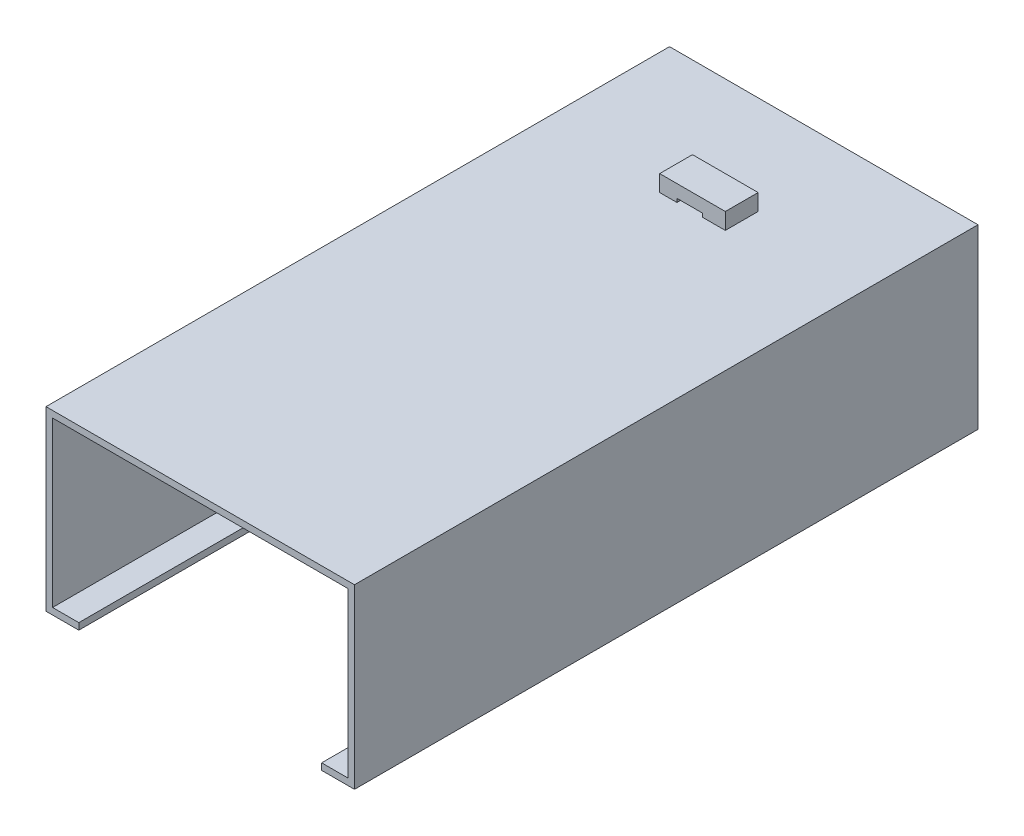
ISO-10303-21;
HEADER;
FILE_DESCRIPTION(('STEP AP214'),'2;1');
FILE_NAME('part.step','',(''),(''),'','','');
FILE_SCHEMA(('AUTOMOTIVE_DESIGN { 1 0 10303 214 1 1 1 1 }'));
ENDSEC;
DATA;
#1=APPLICATION_CONTEXT('core data for automotive mechanical design processes');
#2=APPLICATION_PROTOCOL_DEFINITION('international standard','automotive_design',2000,#1);
#3=PRODUCT_CONTEXT('',#1,'mechanical');
#4=PRODUCT('Part','Part','',(#3));
#5=PRODUCT_RELATED_PRODUCT_CATEGORY('part','',(#4));
#6=PRODUCT_DEFINITION_FORMATION('','',#4);
#7=PRODUCT_DEFINITION_CONTEXT('part definition',#1,'design');
#8=PRODUCT_DEFINITION('design','',#6,#7);
#9=PRODUCT_DEFINITION_SHAPE('','',#8);
#10=(LENGTH_UNIT() NAMED_UNIT(*) SI_UNIT(.MILLI.,.METRE.));
#11=(NAMED_UNIT(*) PLANE_ANGLE_UNIT() SI_UNIT($,.RADIAN.));
#12=(NAMED_UNIT(*) SI_UNIT($,.STERADIAN.) SOLID_ANGLE_UNIT());
#13=UNCERTAINTY_MEASURE_WITH_UNIT(LENGTH_MEASURE(1.E-05),#10,'distance_accuracy_value','');
#14=(GEOMETRIC_REPRESENTATION_CONTEXT(3) GLOBAL_UNCERTAINTY_ASSIGNED_CONTEXT((#13)) GLOBAL_UNIT_ASSIGNED_CONTEXT((#10,
#11,#12)) REPRESENTATION_CONTEXT('',''));
#15=CARTESIAN_POINT('',(0.,0.,0.));
#16=DIRECTION('',(0.,0.,1.));
#17=DIRECTION('',(1.,0.,0.));
#18=AXIS2_PLACEMENT_3D('',#15,#16,#17);
#19=CARTESIAN_POINT('',(-5.96899999999989,3.42900000000013,24.1300000000001));
#20=DIRECTION('',(0.,-1.,0.));
#21=DIRECTION('',(0.,0.,-1.));
#22=AXIS2_PLACEMENT_3D('',#19,#20,#21);
#23=PLANE('',#22);
#24=DIRECTION('',(1.,0.,0.));
#25=VECTOR('',#24,1.);
#26=CARTESIAN_POINT('',(1.2700000000001,3.42900000000024,5.08000000000042));
#27=LINE('',#26,#25);
#28=CARTESIAN_POINT('',(0.381477697240395,3.42900000000024,5.08000000000042));
#29=VERTEX_POINT('',#28);
#30=CARTESIAN_POINT('',(1.2700000000001,3.42900000000024,5.08000000000042));
#31=VERTEX_POINT('',#30);
#32=EDGE_CURVE('E524',#29,#31,#27,.T.);
#33=ORIENTED_EDGE('',*,*,#32,.F.);
#34=DIRECTION('',(0.,0.,1.));
#35=VECTOR('',#34,1.);
#36=CARTESIAN_POINT('',(0.381477697240395,3.42900000000079,-0.00100000000013978));
#37=LINE('',#36,#35);
#38=CARTESIAN_POINT('',(0.381477697240395,3.42900000000013,3.81000000000009));
#39=VERTEX_POINT('',#38);
#40=EDGE_CURVE('E186',#39,#29,#37,.T.);
#41=ORIENTED_EDGE('',*,*,#40,.F.);
#42=DIRECTION('',(-1.,0.,0.));
#43=VECTOR('',#42,1.);
#44=CARTESIAN_POINT('',(1.2700000000001,3.42900000000013,3.81000000000009));
#45=LINE('',#44,#43);
#46=CARTESIAN_POINT('',(1.2700000000001,3.42900000000013,3.81000000000009));
#47=VERTEX_POINT('',#46);
#48=EDGE_CURVE('E200',#47,#39,#45,.T.);
#49=ORIENTED_EDGE('',*,*,#48,.F.);
#50=DIRECTION('',(0.,0.,-1.));
#51=VECTOR('',#50,1.);
#52=CARTESIAN_POINT('',(1.2700000000001,3.42900000000024,5.08000000000042));
#53=LINE('',#52,#51);
#54=EDGE_CURVE('E201',#31,#47,#53,.T.);
#55=ORIENTED_EDGE('',*,*,#54,.F.);
#56=EDGE_LOOP('',(#33,#41,#49,#55));
#57=FACE_BOUND('',#56,.T.);
#58=DIRECTION('',(-1.,0.,0.));
#59=VECTOR('',#58,1.);
#60=CARTESIAN_POINT('',(-5.96899999999989,3.42900000000079,0.));
#61=LINE('',#60,#59);
#62=CARTESIAN_POINT('',(5.96899999999989,3.42900000000079,0.));
#63=VERTEX_POINT('',#62);
#64=CARTESIAN_POINT('',(-5.96899999999989,3.42900000000079,0.));
#65=VERTEX_POINT('',#64);
#66=EDGE_CURVE('E254',#63,#65,#61,.T.);
#67=ORIENTED_EDGE('',*,*,#66,.T.);
#68=DIRECTION('',(0.,0.,-1.));
#69=VECTOR('',#68,1.);
#70=CARTESIAN_POINT('',(-5.96899999999989,3.42900000000013,24.1300000000001));
#71=LINE('',#70,#69);
#72=CARTESIAN_POINT('',(-5.96899999999989,3.42900000000013,24.1300000000001));
#73=VERTEX_POINT('',#72);
#74=EDGE_CURVE('E299',#73,#65,#71,.T.);
#75=ORIENTED_EDGE('',*,*,#74,.F.);
#76=DIRECTION('',(-1.,0.,0.));
#77=VECTOR('',#76,1.);
#78=CARTESIAN_POINT('',(-5.96899999999989,3.42900000000013,24.1300000000001));
#79=LINE('',#78,#77);
#80=CARTESIAN_POINT('',(5.96900000000011,3.42900000000013,24.1300000000001));
#81=VERTEX_POINT('',#80);
#82=EDGE_CURVE('E229',#81,#73,#79,.T.);
#83=ORIENTED_EDGE('',*,*,#82,.F.);
#84=DIRECTION('',(0.,0.,-1.));
#85=VECTOR('',#84,1.);
#86=CARTESIAN_POINT('',(5.96900000000011,3.42900000000013,24.1300000000001));
#87=LINE('',#86,#85);
#88=EDGE_CURVE('E51',#81,#63,#87,.T.);
#89=ORIENTED_EDGE('',*,*,#88,.T.);
#90=EDGE_LOOP('',(#67,#75,#83,#89));
#91=FACE_BOUND('',#90,.T.);
#92=DIRECTION('',(0.,0.,1.));
#93=VECTOR('',#92,1.);
#94=CARTESIAN_POINT('',(-1.2700000000001,3.42900000000024,5.08000000000042));
#95=LINE('',#94,#93);
#96=CARTESIAN_POINT('',(-1.2700000000001,3.42900000000013,3.81000000000009));
#97=VERTEX_POINT('',#96);
#98=CARTESIAN_POINT('',(-1.2700000000001,3.42900000000024,5.08000000000042));
#99=VERTEX_POINT('',#98);
#100=EDGE_CURVE('E198',#97,#99,#95,.T.);
#101=ORIENTED_EDGE('',*,*,#100,.F.);
#102=CARTESIAN_POINT('',(-0.603337681881921,3.42900000000013,3.81000000000009));
#103=VERTEX_POINT('',#102);
#104=EDGE_CURVE('E192',#103,#97,#45,.T.);
#105=ORIENTED_EDGE('',*,*,#104,.F.);
#106=DIRECTION('',(0.,0.,1.));
#107=VECTOR('',#106,1.);
#108=CARTESIAN_POINT('',(-0.603337681881921,3.42900000000079,-0.00100000000013978));
#109=LINE('',#108,#107);
#110=CARTESIAN_POINT('',(-0.603337681881921,3.42900000000024,5.08000000000042));
#111=VERTEX_POINT('',#110);
#112=EDGE_CURVE('E178',#103,#111,#109,.T.);
#113=ORIENTED_EDGE('',*,*,#112,.T.);
#114=EDGE_CURVE('E206',#99,#111,#27,.T.);
#115=ORIENTED_EDGE('',*,*,#114,.F.);
#116=EDGE_LOOP('',(#101,#105,#113,#115));
#117=FACE_BOUND('',#116,.T.);
#118=ADVANCED_FACE('F43',(#57,#91,#117),#23,.F.);
#119=CARTESIAN_POINT('',(4.69900000000001,-3.42899999999979,24.13));
#120=DIRECTION('',(0.,1.,0.));
#121=DIRECTION('',(0.,0.,1.));
#122=AXIS2_PLACEMENT_3D('',#119,#120,#121);
#123=PLANE('',#122);
#124=DIRECTION('',(1.,0.,0.));
#125=VECTOR('',#124,1.);
#126=CARTESIAN_POINT('',(4.69900000000001,-3.42899999999935,4.44089209850063E-13));
#127=LINE('',#126,#125);
#128=CARTESIAN_POINT('',(4.69900000000001,-3.42899999999935,4.44089209850063E-13));
#129=VERTEX_POINT('',#128);
#130=CARTESIAN_POINT('',(5.96899999999989,-3.42899999999935,4.44089209850063E-13));
#131=VERTEX_POINT('',#130);
#132=EDGE_CURVE('E222',#129,#131,#127,.T.);
#133=ORIENTED_EDGE('',*,*,#132,.T.);
#134=DIRECTION('',(0.,0.,-1.));
#135=VECTOR('',#134,1.);
#136=CARTESIAN_POINT('',(5.96900000000011,-3.42899999999979,24.13));
#137=LINE('',#136,#135);
#138=CARTESIAN_POINT('',(5.96900000000011,-3.42899999999979,24.13));
#139=VERTEX_POINT('',#138);
#140=EDGE_CURVE('E11',#139,#131,#137,.T.);
#141=ORIENTED_EDGE('',*,*,#140,.F.);
#142=DIRECTION('',(1.,0.,0.));
#143=VECTOR('',#142,1.);
#144=CARTESIAN_POINT('',(4.69900000000001,-3.42899999999979,24.13));
#145=LINE('',#144,#143);
#146=CARTESIAN_POINT('',(4.69900000000001,-3.42899999999979,24.13));
#147=VERTEX_POINT('',#146);
#148=EDGE_CURVE('E223',#147,#139,#145,.T.);
#149=ORIENTED_EDGE('',*,*,#148,.F.);
#150=DIRECTION('',(0.,0.,-1.));
#151=VECTOR('',#150,1.);
#152=CARTESIAN_POINT('',(4.69900000000001,-3.42899999999979,24.13));
#153=LINE('',#152,#151);
#154=EDGE_CURVE('E249',#147,#129,#153,.T.);
#155=ORIENTED_EDGE('',*,*,#154,.T.);
#156=EDGE_LOOP('',(#133,#141,#149,#155));
#157=FACE_BOUND('',#156,.T.);
#158=ADVANCED_FACE('F45',(#157),#123,.F.);
#159=CARTESIAN_POINT('',(5.96900000000011,3.42900000000013,24.1300000000001));
#160=DIRECTION('',(-1.,0.,0.));
#161=DIRECTION('',(0.,-1.,0.));
#162=AXIS2_PLACEMENT_3D('',#159,#160,#161);
#163=PLANE('',#162);
#164=DIRECTION('',(0.,1.,0.));
#165=VECTOR('',#164,1.);
#166=CARTESIAN_POINT('',(5.96899999999989,3.42900000000079,0.));
#167=LINE('',#166,#165);
#168=EDGE_CURVE('E252',#131,#63,#167,.T.);
#169=ORIENTED_EDGE('',*,*,#168,.T.);
#170=ORIENTED_EDGE('',*,*,#88,.F.);
#171=DIRECTION('',(0.,1.,0.));
#172=VECTOR('',#171,1.);
#173=CARTESIAN_POINT('',(5.96900000000011,3.42900000000013,24.1300000000001));
#174=LINE('',#173,#172);
#175=EDGE_CURVE('E226',#139,#81,#174,.T.);
#176=ORIENTED_EDGE('',*,*,#175,.F.);
#177=ORIENTED_EDGE('',*,*,#140,.T.);
#178=EDGE_LOOP('',(#169,#170,#176,#177));
#179=FACE_BOUND('',#178,.T.);
#180=ADVANCED_FACE('F328',(#179),#163,.F.);
#181=CARTESIAN_POINT('',(-5.96899999999989,3.42900000000013,24.1300000000001));
#182=DIRECTION('',(1.,0.,0.));
#183=DIRECTION('',(0.,1.,0.));
#184=AXIS2_PLACEMENT_3D('',#181,#182,#183);
#185=PLANE('',#184);
#186=DIRECTION('',(0.,-1.,0.));
#187=VECTOR('',#186,1.);
#188=CARTESIAN_POINT('',(-5.96899999999989,3.42900000000079,0.));
#189=LINE('',#188,#187);
#190=CARTESIAN_POINT('',(-5.96899999999989,-3.42899999999935,4.44089209850063E-13));
#191=VERTEX_POINT('',#190);
#192=EDGE_CURVE('E256',#65,#191,#189,.T.);
#193=ORIENTED_EDGE('',*,*,#192,.T.);
#194=DIRECTION('',(0.,0.,-1.));
#195=VECTOR('',#194,1.);
#196=CARTESIAN_POINT('',(-5.96899999999989,-3.42899999999979,24.13));
#197=LINE('',#196,#195);
#198=CARTESIAN_POINT('',(-5.96899999999989,-3.42899999999979,24.13));
#199=VERTEX_POINT('',#198);
#200=EDGE_CURVE('E296',#199,#191,#197,.T.);
#201=ORIENTED_EDGE('',*,*,#200,.F.);
#202=DIRECTION('',(0.,-1.,0.));
#203=VECTOR('',#202,1.);
#204=CARTESIAN_POINT('',(-5.96899999999989,3.42900000000013,24.1300000000001));
#205=LINE('',#204,#203);
#206=EDGE_CURVE('E231',#73,#199,#205,.T.);
#207=ORIENTED_EDGE('',*,*,#206,.F.);
#208=ORIENTED_EDGE('',*,*,#74,.T.);
#209=EDGE_LOOP('',(#193,#201,#207,#208));
#210=FACE_BOUND('',#209,.T.);
#211=ADVANCED_FACE('F316',(#210),#185,.F.);
#212=CARTESIAN_POINT('',(-5.96899999999989,-3.42899999999979,24.13));
#213=DIRECTION('',(0.,1.,0.));
#214=DIRECTION('',(0.,0.,1.));
#215=AXIS2_PLACEMENT_3D('',#212,#213,#214);
#216=PLANE('',#215);
#217=DIRECTION('',(1.,0.,0.));
#218=VECTOR('',#217,1.);
#219=CARTESIAN_POINT('',(-5.96899999999989,-3.42899999999935,4.44089209850063E-13));
#220=LINE('',#219,#218);
#221=CARTESIAN_POINT('',(-4.69900000000001,-3.42899999999935,4.44089209850063E-13));
#222=VERTEX_POINT('',#221);
#223=EDGE_CURVE('E258',#191,#222,#220,.T.);
#224=ORIENTED_EDGE('',*,*,#223,.T.);
#225=DIRECTION('',(0.,0.,-1.));
#226=VECTOR('',#225,1.);
#227=CARTESIAN_POINT('',(-4.69900000000001,-3.42899999999979,24.13));
#228=LINE('',#227,#226);
#229=CARTESIAN_POINT('',(-4.69900000000001,-3.42899999999979,24.13));
#230=VERTEX_POINT('',#229);
#231=EDGE_CURVE('E293',#230,#222,#228,.T.);
#232=ORIENTED_EDGE('',*,*,#231,.F.);
#233=DIRECTION('',(1.,0.,0.));
#234=VECTOR('',#233,1.);
#235=CARTESIAN_POINT('',(-5.96899999999989,-3.42899999999979,24.13));
#236=LINE('',#235,#234);
#237=EDGE_CURVE('E233',#199,#230,#236,.T.);
#238=ORIENTED_EDGE('',*,*,#237,.F.);
#239=ORIENTED_EDGE('',*,*,#200,.T.);
#240=EDGE_LOOP('',(#224,#232,#238,#239));
#241=FACE_BOUND('',#240,.T.);
#242=ADVANCED_FACE('F320',(#241),#216,.F.);
#243=CARTESIAN_POINT('',(-4.69900000000001,-3.17499999999948,24.13));
#244=DIRECTION('',(-1.,0.,0.));
#245=DIRECTION('',(0.,0.,1.));
#246=AXIS2_PLACEMENT_3D('',#243,#244,#245);
#247=PLANE('',#246);
#248=DIRECTION('',(0.,1.,0.));
#249=VECTOR('',#248,1.);
#250=CARTESIAN_POINT('',(-4.69900000000001,-3.17499999999982,0.));
#251=LINE('',#250,#249);
#252=CARTESIAN_POINT('',(-4.69900000000001,-3.17499999999982,0.));
#253=VERTEX_POINT('',#252);
#254=EDGE_CURVE('E260',#222,#253,#251,.T.);
#255=ORIENTED_EDGE('',*,*,#254,.T.);
#256=DIRECTION('',(0.,0.,-1.));
#257=VECTOR('',#256,1.);
#258=CARTESIAN_POINT('',(-4.69900000000001,-3.17499999999948,24.13));
#259=LINE('',#258,#257);
#260=CARTESIAN_POINT('',(-4.69900000000001,-3.17499999999948,24.13));
#261=VERTEX_POINT('',#260);
#262=EDGE_CURVE('E290',#261,#253,#259,.T.);
#263=ORIENTED_EDGE('',*,*,#262,.F.);
#264=DIRECTION('',(0.,1.,0.));
#265=VECTOR('',#264,1.);
#266=CARTESIAN_POINT('',(-4.69900000000001,-3.17499999999948,24.13));
#267=LINE('',#266,#265);
#268=EDGE_CURVE('E235',#230,#261,#267,.T.);
#269=ORIENTED_EDGE('',*,*,#268,.F.);
#270=ORIENTED_EDGE('',*,*,#231,.T.);
#271=EDGE_LOOP('',(#255,#263,#269,#270));
#272=FACE_BOUND('',#271,.T.);
#273=ADVANCED_FACE('F361',(#272),#247,.F.);
#274=CARTESIAN_POINT('',(-5.71499999999991,-3.17499999999948,24.13));
#275=DIRECTION('',(0.,-1.,0.));
#276=DIRECTION('',(1.,0.,0.));
#277=AXIS2_PLACEMENT_3D('',#274,#275,#276);
#278=PLANE('',#277);
#279=DIRECTION('',(-1.,0.,0.));
#280=VECTOR('',#279,1.);
#281=CARTESIAN_POINT('',(-5.71499999999991,-3.17499999999982,0.));
#282=LINE('',#281,#280);
#283=CARTESIAN_POINT('',(-5.71499999999991,-3.17499999999982,0.));
#284=VERTEX_POINT('',#283);
#285=EDGE_CURVE('E262',#253,#284,#282,.T.);
#286=ORIENTED_EDGE('',*,*,#285,.T.);
#287=DIRECTION('',(0.,0.,-1.));
#288=VECTOR('',#287,1.);
#289=CARTESIAN_POINT('',(-5.71499999999991,-3.17499999999948,24.13));
#290=LINE('',#289,#288);
#291=CARTESIAN_POINT('',(-5.71499999999991,-3.17499999999948,24.13));
#292=VERTEX_POINT('',#291);
#293=EDGE_CURVE('E287',#292,#284,#290,.T.);
#294=ORIENTED_EDGE('',*,*,#293,.F.);
#295=DIRECTION('',(-1.,0.,0.));
#296=VECTOR('',#295,1.);
#297=CARTESIAN_POINT('',(-5.71499999999991,-3.17499999999948,24.13));
#298=LINE('',#297,#296);
#299=EDGE_CURVE('E237',#261,#292,#298,.T.);
#300=ORIENTED_EDGE('',*,*,#299,.F.);
#301=ORIENTED_EDGE('',*,*,#262,.T.);
#302=EDGE_LOOP('',(#286,#294,#300,#301));
#303=FACE_BOUND('',#302,.T.);
#304=ADVANCED_FACE('F359',(#303),#278,.F.);
#305=CARTESIAN_POINT('',(-5.71499999999991,3.17500000000104,24.1300000000004));
#306=DIRECTION('',(-1.,0.,0.));
#307=DIRECTION('',(0.,-1.,0.));
#308=AXIS2_PLACEMENT_3D('',#305,#306,#307);
#309=PLANE('',#308);
#310=DIRECTION('',(0.,1.,0.));
#311=VECTOR('',#310,1.);
#312=CARTESIAN_POINT('',(-5.71499999999991,3.17500000000015,4.44089209850063E-13));
#313=LINE('',#312,#311);
#314=CARTESIAN_POINT('',(-5.71499999999991,3.17500000000015,4.44089209850063E-13));
#315=VERTEX_POINT('',#314);
#316=EDGE_CURVE('E264',#284,#315,#313,.T.);
#317=ORIENTED_EDGE('',*,*,#316,.T.);
#318=DIRECTION('',(0.,0.,-1.));
#319=VECTOR('',#318,1.);
#320=CARTESIAN_POINT('',(-5.71499999999991,3.17500000000104,24.1300000000004));
#321=LINE('',#320,#319);
#322=CARTESIAN_POINT('',(-5.71499999999991,3.17500000000104,24.1300000000004));
#323=VERTEX_POINT('',#322);
#324=EDGE_CURVE('E284',#323,#315,#321,.T.);
#325=ORIENTED_EDGE('',*,*,#324,.F.);
#326=DIRECTION('',(0.,1.,0.));
#327=VECTOR('',#326,1.);
#328=CARTESIAN_POINT('',(-5.71499999999991,3.17500000000104,24.1300000000004));
#329=LINE('',#328,#327);
#330=EDGE_CURVE('E239',#292,#323,#329,.T.);
#331=ORIENTED_EDGE('',*,*,#330,.F.);
#332=ORIENTED_EDGE('',*,*,#293,.T.);
#333=EDGE_LOOP('',(#317,#325,#331,#332));
#334=FACE_BOUND('',#333,.T.);
#335=ADVANCED_FACE('F355',(#334),#309,.F.);
#336=CARTESIAN_POINT('',(-5.71499999999991,3.17500000000104,24.1300000000004));
#337=DIRECTION('',(0.,1.,0.));
#338=DIRECTION('',(0.,0.,1.));
#339=AXIS2_PLACEMENT_3D('',#336,#337,#338);
#340=PLANE('',#339);
#341=DIRECTION('',(1.,0.,0.));
#342=VECTOR('',#341,1.);
#343=CARTESIAN_POINT('',(-5.71499999999991,3.17500000000015,4.44089209850063E-13));
#344=LINE('',#343,#342);
#345=CARTESIAN_POINT('',(5.71499999999991,3.17500000000015,4.44089209850063E-13));
#346=VERTEX_POINT('',#345);
#347=EDGE_CURVE('E266',#315,#346,#344,.T.);
#348=ORIENTED_EDGE('',*,*,#347,.T.);
#349=DIRECTION('',(0.,0.,-1.));
#350=VECTOR('',#349,1.);
#351=CARTESIAN_POINT('',(5.71499999999991,3.17500000000104,24.1300000000004));
#352=LINE('',#351,#350);
#353=CARTESIAN_POINT('',(5.71499999999991,3.17500000000104,24.1300000000004));
#354=VERTEX_POINT('',#353);
#355=EDGE_CURVE('E281',#354,#346,#352,.T.);
#356=ORIENTED_EDGE('',*,*,#355,.F.);
#357=DIRECTION('',(1.,0.,0.));
#358=VECTOR('',#357,1.);
#359=CARTESIAN_POINT('',(-5.71499999999991,3.17500000000104,24.1300000000004));
#360=LINE('',#359,#358);
#361=EDGE_CURVE('E241',#323,#354,#360,.T.);
#362=ORIENTED_EDGE('',*,*,#361,.F.);
#363=ORIENTED_EDGE('',*,*,#324,.T.);
#364=EDGE_LOOP('',(#348,#356,#362,#363));
#365=FACE_BOUND('',#364,.T.);
#366=ADVANCED_FACE('F350',(#365),#340,.F.);
#367=CARTESIAN_POINT('',(5.71499999999991,3.17500000000104,24.1300000000004));
#368=DIRECTION('',(1.,0.,0.));
#369=DIRECTION('',(0.,0.,-1.));
#370=AXIS2_PLACEMENT_3D('',#367,#368,#369);
#371=PLANE('',#370);
#372=DIRECTION('',(0.,-1.,0.));
#373=VECTOR('',#372,1.);
#374=CARTESIAN_POINT('',(5.71499999999991,3.17500000000015,4.44089209850063E-13));
#375=LINE('',#374,#373);
#376=CARTESIAN_POINT('',(5.71499999999991,-3.17499999999982,0.));
#377=VERTEX_POINT('',#376);
#378=EDGE_CURVE('E268',#346,#377,#375,.T.);
#379=ORIENTED_EDGE('',*,*,#378,.T.);
#380=DIRECTION('',(0.,0.,-1.));
#381=VECTOR('',#380,1.);
#382=CARTESIAN_POINT('',(5.71499999999991,-3.17499999999948,24.13));
#383=LINE('',#382,#381);
#384=CARTESIAN_POINT('',(5.71499999999991,-3.17499999999948,24.13));
#385=VERTEX_POINT('',#384);
#386=EDGE_CURVE('E278',#385,#377,#383,.T.);
#387=ORIENTED_EDGE('',*,*,#386,.F.);
#388=DIRECTION('',(0.,-1.,0.));
#389=VECTOR('',#388,1.);
#390=CARTESIAN_POINT('',(5.71499999999991,3.17500000000104,24.1300000000004));
#391=LINE('',#390,#389);
#392=EDGE_CURVE('E243',#354,#385,#391,.T.);
#393=ORIENTED_EDGE('',*,*,#392,.F.);
#394=ORIENTED_EDGE('',*,*,#355,.T.);
#395=EDGE_LOOP('',(#379,#387,#393,#394));
#396=FACE_BOUND('',#395,.T.);
#397=ADVANCED_FACE('F344',(#396),#371,.F.);
#398=CARTESIAN_POINT('',(4.69900000000001,-3.17499999999948,24.13));
#399=DIRECTION('',(0.,-1.,0.));
#400=DIRECTION('',(1.,0.,0.));
#401=AXIS2_PLACEMENT_3D('',#398,#399,#400);
#402=PLANE('',#401);
#403=DIRECTION('',(-1.,0.,0.));
#404=VECTOR('',#403,1.);
#405=CARTESIAN_POINT('',(4.69900000000001,-3.17499999999982,0.));
#406=LINE('',#405,#404);
#407=CARTESIAN_POINT('',(4.69900000000001,-3.17499999999982,0.));
#408=VERTEX_POINT('',#407);
#409=EDGE_CURVE('E270',#377,#408,#406,.T.);
#410=ORIENTED_EDGE('',*,*,#409,.T.);
#411=DIRECTION('',(0.,0.,-1.));
#412=VECTOR('',#411,1.);
#413=CARTESIAN_POINT('',(4.69900000000001,-3.17499999999948,24.13));
#414=LINE('',#413,#412);
#415=CARTESIAN_POINT('',(4.69900000000001,-3.17499999999948,24.13));
#416=VERTEX_POINT('',#415);
#417=EDGE_CURVE('E275',#416,#408,#414,.T.);
#418=ORIENTED_EDGE('',*,*,#417,.F.);
#419=DIRECTION('',(-1.,0.,0.));
#420=VECTOR('',#419,1.);
#421=CARTESIAN_POINT('',(4.69900000000001,-3.17499999999948,24.13));
#422=LINE('',#421,#420);
#423=EDGE_CURVE('E245',#385,#416,#422,.T.);
#424=ORIENTED_EDGE('',*,*,#423,.F.);
#425=ORIENTED_EDGE('',*,*,#386,.T.);
#426=EDGE_LOOP('',(#410,#418,#424,#425));
#427=FACE_BOUND('',#426,.T.);
#428=ADVANCED_FACE('F340',(#427),#402,.F.);
#429=CARTESIAN_POINT('',(4.69900000000001,-3.17499999999948,24.13));
#430=DIRECTION('',(1.,0.,0.));
#431=DIRECTION('',(0.,0.,-1.));
#432=AXIS2_PLACEMENT_3D('',#429,#430,#431);
#433=PLANE('',#432);
#434=DIRECTION('',(0.,-1.,0.));
#435=VECTOR('',#434,1.);
#436=CARTESIAN_POINT('',(4.69900000000001,-3.17499999999982,0.));
#437=LINE('',#436,#435);
#438=EDGE_CURVE('E227',#408,#129,#437,.T.);
#439=ORIENTED_EDGE('',*,*,#438,.T.);
#440=ORIENTED_EDGE('',*,*,#154,.F.);
#441=DIRECTION('',(0.,-1.,0.));
#442=VECTOR('',#441,1.);
#443=CARTESIAN_POINT('',(4.69900000000001,-3.17499999999948,24.13));
#444=LINE('',#443,#442);
#445=EDGE_CURVE('E247',#416,#147,#444,.T.);
#446=ORIENTED_EDGE('',*,*,#445,.F.);
#447=ORIENTED_EDGE('',*,*,#417,.T.);
#448=EDGE_LOOP('',(#439,#440,#446,#447));
#449=FACE_BOUND('',#448,.T.);
#450=ADVANCED_FACE('F335',(#449),#433,.F.);
#451=CARTESIAN_POINT('',(0.,1.11022302462516E-13,24.13));
#452=DIRECTION('',(0.,0.,-1.));
#453=DIRECTION('',(-1.,0.,0.));
#454=AXIS2_PLACEMENT_3D('',#451,#452,#453);
#455=PLANE('',#454);
#456=ORIENTED_EDGE('',*,*,#148,.T.);
#457=ORIENTED_EDGE('',*,*,#175,.T.);
#458=ORIENTED_EDGE('',*,*,#82,.T.);
#459=ORIENTED_EDGE('',*,*,#206,.T.);
#460=ORIENTED_EDGE('',*,*,#237,.T.);
#461=ORIENTED_EDGE('',*,*,#268,.T.);
#462=ORIENTED_EDGE('',*,*,#299,.T.);
#463=ORIENTED_EDGE('',*,*,#330,.T.);
#464=ORIENTED_EDGE('',*,*,#361,.T.);
#465=ORIENTED_EDGE('',*,*,#392,.T.);
#466=ORIENTED_EDGE('',*,*,#423,.T.);
#467=ORIENTED_EDGE('',*,*,#445,.T.);
#468=EDGE_LOOP('',(#456,#457,#458,#459,#460,#461,#462,#463,#464,#465,#466,#467));
#469=FACE_BOUND('',#468,.T.);
#470=ADVANCED_FACE('F324',(#469),#455,.F.);
#471=CARTESIAN_POINT('',(0.,0.,0.));
#472=DIRECTION('',(0.,0.,-1.));
#473=DIRECTION('',(-1.,0.,0.));
#474=AXIS2_PLACEMENT_3D('',#471,#472,#473);
#475=PLANE('',#474);
#476=ORIENTED_EDGE('',*,*,#132,.F.);
#477=ORIENTED_EDGE('',*,*,#438,.F.);
#478=ORIENTED_EDGE('',*,*,#409,.F.);
#479=ORIENTED_EDGE('',*,*,#378,.F.);
#480=ORIENTED_EDGE('',*,*,#347,.F.);
#481=ORIENTED_EDGE('',*,*,#316,.F.);
#482=ORIENTED_EDGE('',*,*,#285,.F.);
#483=ORIENTED_EDGE('',*,*,#254,.F.);
#484=ORIENTED_EDGE('',*,*,#223,.F.);
#485=ORIENTED_EDGE('',*,*,#192,.F.);
#486=ORIENTED_EDGE('',*,*,#66,.F.);
#487=ORIENTED_EDGE('',*,*,#168,.F.);
#488=EDGE_LOOP('',(#476,#477,#478,#479,#480,#481,#482,#483,#484,#485,#486,#487));
#489=FACE_BOUND('',#488,.T.);
#490=ADVANCED_FACE('F311',(#489),#475,.T.);
#491=CARTESIAN_POINT('',(-1.2700000000001,4.06400000000018,5.07999999999997));
#492=DIRECTION('',(1.,0.,0.));
#493=DIRECTION('',(0.,0.,-1.));
#494=AXIS2_PLACEMENT_3D('',#491,#492,#493);
#495=PLANE('',#494);
#496=ORIENTED_EDGE('',*,*,#100,.T.);
#497=DIRECTION('',(0.,-1.,0.));
#498=VECTOR('',#497,1.);
#499=CARTESIAN_POINT('',(-1.2700000000001,4.06400000000018,5.07999999999997));
#500=LINE('',#499,#498);
#501=CARTESIAN_POINT('',(-1.2700000000001,4.06400000000018,5.07999999999997));
#502=VERTEX_POINT('',#501);
#503=EDGE_CURVE('E219',#502,#99,#500,.T.);
#504=ORIENTED_EDGE('',*,*,#503,.F.);
#505=DIRECTION('',(0.,0.,1.));
#506=VECTOR('',#505,1.);
#507=CARTESIAN_POINT('',(-1.2700000000001,4.06400000000018,5.07999999999997));
#508=LINE('',#507,#506);
#509=CARTESIAN_POINT('',(-1.2700000000001,4.06400000000096,3.81000000000009));
#510=VERTEX_POINT('',#509);
#511=EDGE_CURVE('E204',#510,#502,#508,.T.);
#512=ORIENTED_EDGE('',*,*,#511,.F.);
#513=DIRECTION('',(0.,-1.,0.));
#514=VECTOR('',#513,1.);
#515=CARTESIAN_POINT('',(-1.2700000000001,4.06400000000096,3.81000000000009));
#516=LINE('',#515,#514);
#517=EDGE_CURVE('E210',#510,#97,#516,.T.);
#518=ORIENTED_EDGE('',*,*,#517,.T.);
#519=EDGE_LOOP('',(#496,#504,#512,#518));
#520=FACE_BOUND('',#519,.T.);
#521=ADVANCED_FACE('F439',(#520),#495,.F.);
#522=CARTESIAN_POINT('',(1.2700000000001,4.06400000000018,5.07999999999997));
#523=DIRECTION('',(0.,0.,-1.));
#524=DIRECTION('',(-1.,0.,0.));
#525=AXIS2_PLACEMENT_3D('',#522,#523,#524);
#526=PLANE('',#525);
#527=ORIENTED_EDGE('',*,*,#114,.T.);
#528=DIRECTION('',(0.,-1.,0.));
#529=VECTOR('',#528,1.);
#530=CARTESIAN_POINT('',(-0.603337681881921,3.42900000000024,5.08000000000042));
#531=LINE('',#530,#529);
#532=CARTESIAN_POINT('',(-0.603337681881921,3.56876396760009,5.0800000000002));
#533=VERTEX_POINT('',#532);
#534=EDGE_CURVE('E58',#533,#111,#531,.T.);
#535=ORIENTED_EDGE('',*,*,#534,.F.);
#536=DIRECTION('',(-1.,0.,0.));
#537=VECTOR('',#536,1.);
#538=CARTESIAN_POINT('',(-0.603337681881921,3.56876396760009,5.0800000000002));
#539=LINE('',#538,#537);
#540=CARTESIAN_POINT('',(0.381477697240395,3.56876396760009,5.0800000000002));
#541=VERTEX_POINT('',#540);
#542=EDGE_CURVE('E187',#541,#533,#539,.T.);
#543=ORIENTED_EDGE('',*,*,#542,.F.);
#544=DIRECTION('',(0.,1.,0.));
#545=VECTOR('',#544,1.);
#546=CARTESIAN_POINT('',(0.381477697240395,3.42900000000024,5.08000000000042));
#547=LINE('',#546,#545);
#548=EDGE_CURVE('E511',#29,#541,#547,.T.);
#549=ORIENTED_EDGE('',*,*,#548,.F.);
#550=ORIENTED_EDGE('',*,*,#32,.T.);
#551=DIRECTION('',(0.,-1.,0.));
#552=VECTOR('',#551,1.);
#553=CARTESIAN_POINT('',(1.2700000000001,4.06400000000018,5.07999999999997));
#554=LINE('',#553,#552);
#555=CARTESIAN_POINT('',(1.2700000000001,4.06400000000018,5.07999999999997));
#556=VERTEX_POINT('',#555);
#557=EDGE_CURVE('E216',#556,#31,#554,.T.);
#558=ORIENTED_EDGE('',*,*,#557,.F.);
#559=DIRECTION('',(1.,0.,0.));
#560=VECTOR('',#559,1.);
#561=CARTESIAN_POINT('',(1.2700000000001,4.06400000000018,5.07999999999997));
#562=LINE('',#561,#560);
#563=EDGE_CURVE('E519',#502,#556,#562,.T.);
#564=ORIENTED_EDGE('',*,*,#563,.F.);
#565=ORIENTED_EDGE('',*,*,#503,.T.);
#566=EDGE_LOOP('',(#527,#535,#543,#549,#550,#558,#564,#565));
#567=FACE_BOUND('',#566,.T.);
#568=ADVANCED_FACE('F451',(#567),#526,.F.);
#569=CARTESIAN_POINT('',(1.2700000000001,4.06400000000018,5.07999999999997));
#570=DIRECTION('',(-1.,0.,0.));
#571=DIRECTION('',(0.,0.,1.));
#572=AXIS2_PLACEMENT_3D('',#569,#570,#571);
#573=PLANE('',#572);
#574=ORIENTED_EDGE('',*,*,#54,.T.);
#575=DIRECTION('',(0.,-1.,0.));
#576=VECTOR('',#575,1.);
#577=CARTESIAN_POINT('',(1.2700000000001,4.06400000000096,3.81000000000009));
#578=LINE('',#577,#576);
#579=CARTESIAN_POINT('',(1.2700000000001,4.06400000000096,3.81000000000009));
#580=VERTEX_POINT('',#579);
#581=EDGE_CURVE('E212',#580,#47,#578,.T.);
#582=ORIENTED_EDGE('',*,*,#581,.F.);
#583=DIRECTION('',(0.,0.,-1.));
#584=VECTOR('',#583,1.);
#585=CARTESIAN_POINT('',(1.2700000000001,4.06400000000018,5.07999999999997));
#586=LINE('',#585,#584);
#587=EDGE_CURVE('E521',#556,#580,#586,.T.);
#588=ORIENTED_EDGE('',*,*,#587,.F.);
#589=ORIENTED_EDGE('',*,*,#557,.T.);
#590=EDGE_LOOP('',(#574,#582,#588,#589));
#591=FACE_BOUND('',#590,.T.);
#592=ADVANCED_FACE('F459',(#591),#573,.F.);
#593=CARTESIAN_POINT('',(1.2700000000001,4.06400000000096,3.81000000000009));
#594=DIRECTION('',(0.,0.,1.));
#595=DIRECTION('',(1.,0.,0.));
#596=AXIS2_PLACEMENT_3D('',#593,#594,#595);
#597=PLANE('',#596);
#598=DIRECTION('',(1.,0.,0.));
#599=VECTOR('',#598,1.);
#600=CARTESIAN_POINT('',(-0.603337681881921,3.56876396760009,3.81000000000054));
#601=LINE('',#600,#599);
#602=CARTESIAN_POINT('',(-0.603337681881921,3.56876396760009,3.81000000000054));
#603=VERTEX_POINT('',#602);
#604=CARTESIAN_POINT('',(0.381477697240395,3.56876396760009,3.81000000000054));
#605=VERTEX_POINT('',#604);
#606=EDGE_CURVE('E195',#603,#605,#601,.T.);
#607=ORIENTED_EDGE('',*,*,#606,.F.);
#608=DIRECTION('',(0.,1.,0.));
#609=VECTOR('',#608,1.);
#610=CARTESIAN_POINT('',(-0.603337681881921,3.42900000000013,3.81000000000009));
#611=LINE('',#610,#609);
#612=EDGE_CURVE('E181',#103,#603,#611,.T.);
#613=ORIENTED_EDGE('',*,*,#612,.F.);
#614=ORIENTED_EDGE('',*,*,#104,.T.);
#615=ORIENTED_EDGE('',*,*,#517,.F.);
#616=DIRECTION('',(-1.,0.,0.));
#617=VECTOR('',#616,1.);
#618=CARTESIAN_POINT('',(1.2700000000001,4.06400000000096,3.81000000000009));
#619=LINE('',#618,#617);
#620=EDGE_CURVE('E213',#580,#510,#619,.T.);
#621=ORIENTED_EDGE('',*,*,#620,.F.);
#622=ORIENTED_EDGE('',*,*,#581,.T.);
#623=ORIENTED_EDGE('',*,*,#48,.T.);
#624=DIRECTION('',(0.,-1.,0.));
#625=VECTOR('',#624,1.);
#626=CARTESIAN_POINT('',(0.381477697240395,3.42900000000013,3.81000000000009));
#627=LINE('',#626,#625);
#628=EDGE_CURVE('E66',#605,#39,#627,.T.);
#629=ORIENTED_EDGE('',*,*,#628,.F.);
#630=EDGE_LOOP('',(#607,#613,#614,#615,#621,#622,#623,#629));
#631=FACE_BOUND('',#630,.T.);
#632=ADVANCED_FACE('F190',(#631),#597,.F.);
#633=CARTESIAN_POINT('',(0.,4.06400000000029,4.44089209850063E-13));
#634=DIRECTION('',(0.,1.,0.));
#635=DIRECTION('',(0.,0.,1.));
#636=AXIS2_PLACEMENT_3D('',#633,#634,#635);
#637=PLANE('',#636);
#638=ORIENTED_EDGE('',*,*,#511,.T.);
#639=ORIENTED_EDGE('',*,*,#563,.T.);
#640=ORIENTED_EDGE('',*,*,#587,.T.);
#641=ORIENTED_EDGE('',*,*,#620,.T.);
#642=EDGE_LOOP('',(#638,#639,#640,#641));
#643=FACE_BOUND('',#642,.T.);
#644=ADVANCED_FACE('F474',(#643),#637,.T.);
#645=CARTESIAN_POINT('',(-0.603337681881921,3.42900000000079,-0.00100000000013978));
#646=DIRECTION('',(-1.,0.,0.));
#647=DIRECTION('',(0.,0.,1.));
#648=AXIS2_PLACEMENT_3D('',#645,#646,#647);
#649=PLANE('',#648);
#650=ORIENTED_EDGE('',*,*,#612,.T.);
#651=DIRECTION('',(0.,0.,1.));
#652=VECTOR('',#651,1.);
#653=CARTESIAN_POINT('',(-0.603337681881921,3.56876396760009,-0.000999999999695689));
#654=LINE('',#653,#652);
#655=EDGE_CURVE('E506',#603,#533,#654,.T.);
#656=ORIENTED_EDGE('',*,*,#655,.T.);
#657=ORIENTED_EDGE('',*,*,#534,.T.);
#658=ORIENTED_EDGE('',*,*,#112,.F.);
#659=EDGE_LOOP('',(#650,#656,#657,#658));
#660=FACE_BOUND('',#659,.T.);
#661=ADVANCED_FACE('F180',(#660),#649,.F.);
#662=CARTESIAN_POINT('',(-0.603337681881921,3.56876396760009,-0.000999999999695689));
#663=DIRECTION('',(0.,1.,0.));
#664=DIRECTION('',(0.,0.,1.));
#665=AXIS2_PLACEMENT_3D('',#662,#663,#664);
#666=PLANE('',#665);
#667=ORIENTED_EDGE('',*,*,#606,.T.);
#668=DIRECTION('',(0.,0.,1.));
#669=VECTOR('',#668,1.);
#670=CARTESIAN_POINT('',(0.381477697240395,3.56876396760009,-0.000999999999695689));
#671=LINE('',#670,#669);
#672=EDGE_CURVE('E504',#605,#541,#671,.T.);
#673=ORIENTED_EDGE('',*,*,#672,.T.);
#674=ORIENTED_EDGE('',*,*,#542,.T.);
#675=ORIENTED_EDGE('',*,*,#655,.F.);
#676=EDGE_LOOP('',(#667,#673,#674,#675));
#677=FACE_BOUND('',#676,.T.);
#678=ADVANCED_FACE('F486',(#677),#666,.F.);
#679=CARTESIAN_POINT('',(0.381477697240395,3.42900000000079,-0.00100000000013978));
#680=DIRECTION('',(1.,0.,0.));
#681=DIRECTION('',(0.,0.,-1.));
#682=AXIS2_PLACEMENT_3D('',#679,#680,#681);
#683=PLANE('',#682);
#684=ORIENTED_EDGE('',*,*,#628,.T.);
#685=ORIENTED_EDGE('',*,*,#40,.T.);
#686=ORIENTED_EDGE('',*,*,#548,.T.);
#687=ORIENTED_EDGE('',*,*,#672,.F.);
#688=EDGE_LOOP('',(#684,#685,#686,#687));
#689=FACE_BOUND('',#688,.T.);
#690=ADVANCED_FACE('F493',(#689),#683,.F.);
#691=CLOSED_SHELL('',(#118,#158,#180,#211,#242,#273,#304,#335,#366,#397,#428,#450,#470,#490,
#521,#568,#592,#632,#644,#661,#678,#690));
#692=MANIFOLD_SOLID_BREP('B2',#691);
#693=ADVANCED_BREP_SHAPE_REPRESENTATION('',(#18,#692),#14);
#694=SHAPE_DEFINITION_REPRESENTATION(#9,#693);
ENDSEC;
END-ISO-10303-21;
